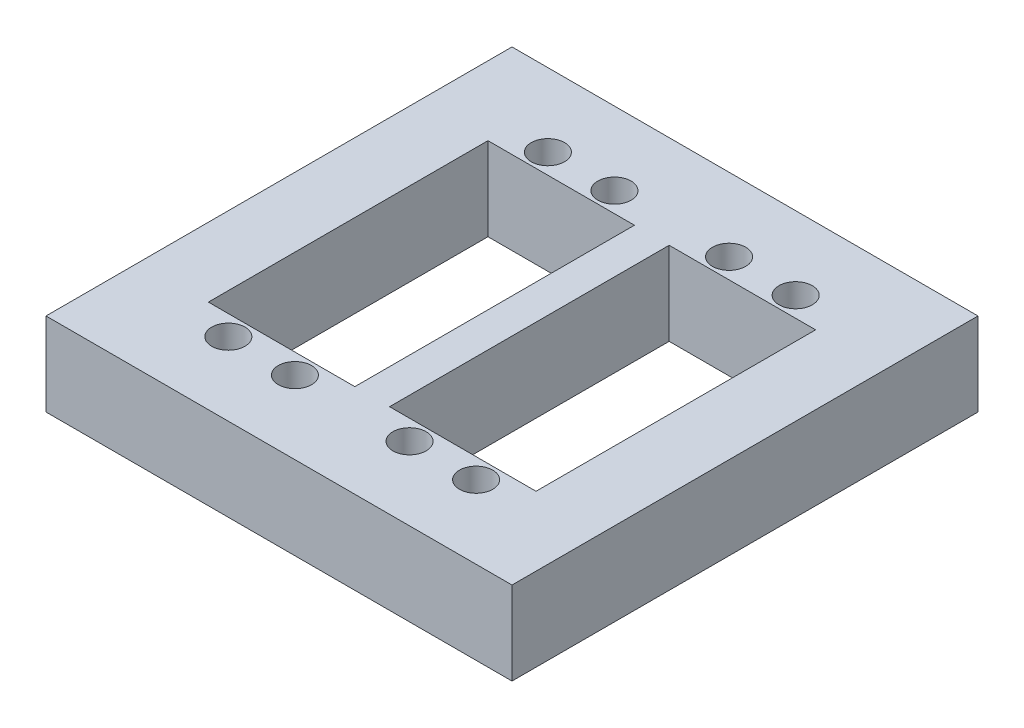
ISO-10303-21;
HEADER;
FILE_DESCRIPTION(('STEP AP214'),'2;1');
FILE_NAME('part.step','',(''),(''),'','','');
FILE_SCHEMA(('AUTOMOTIVE_DESIGN { 1 0 10303 214 1 1 1 1 }'));
ENDSEC;
DATA;
#1=APPLICATION_CONTEXT('core data for automotive mechanical design processes');
#2=APPLICATION_PROTOCOL_DEFINITION('international standard','automotive_design',2000,#1);
#3=PRODUCT_CONTEXT('',#1,'mechanical');
#4=PRODUCT('Part','Part','',(#3));
#5=PRODUCT_RELATED_PRODUCT_CATEGORY('part','',(#4));
#6=PRODUCT_DEFINITION_FORMATION('','',#4);
#7=PRODUCT_DEFINITION_CONTEXT('part definition',#1,'design');
#8=PRODUCT_DEFINITION('design','',#6,#7);
#9=PRODUCT_DEFINITION_SHAPE('','',#8);
#10=(LENGTH_UNIT() NAMED_UNIT(*) SI_UNIT(.MILLI.,.METRE.));
#11=(NAMED_UNIT(*) PLANE_ANGLE_UNIT() SI_UNIT($,.RADIAN.));
#12=(NAMED_UNIT(*) SI_UNIT($,.STERADIAN.) SOLID_ANGLE_UNIT());
#13=UNCERTAINTY_MEASURE_WITH_UNIT(LENGTH_MEASURE(1.E-05),#10,'distance_accuracy_value','');
#14=(GEOMETRIC_REPRESENTATION_CONTEXT(3) GLOBAL_UNCERTAINTY_ASSIGNED_CONTEXT((#13)) GLOBAL_UNIT_ASSIGNED_CONTEXT((#10,
#11,#12)) REPRESENTATION_CONTEXT('',''));
#15=CARTESIAN_POINT('',(0.,0.,0.));
#16=DIRECTION('',(0.,0.,1.));
#17=DIRECTION('',(1.,0.,0.));
#18=AXIS2_PLACEMENT_3D('',#15,#16,#17);
#19=CARTESIAN_POINT('',(0.,12.5,0.));
#20=DIRECTION('',(0.,1.,0.));
#21=DIRECTION('',(0.,0.,1.));
#22=AXIS2_PLACEMENT_3D('',#19,#20,#21);
#23=PLANE('',#22);
#24=CARTESIAN_POINT('',(8.60850096518641,12.5,-24.));
#25=DIRECTION('',(0.,1.,0.));
#26=DIRECTION('',(0.,0.,-1.));
#27=AXIS2_PLACEMENT_3D('',#24,#25,#26);
#28=CIRCLE('',#27,2.5);
#29=CARTESIAN_POINT('',(8.60850096518641,12.5,-26.5));
#30=VERTEX_POINT('',#29);
#31=EDGE_CURVE('E191',#30,#30,#28,.T.);
#32=ORIENTED_EDGE('',*,*,#31,.F.);
#33=EDGE_LOOP('',(#32));
#34=FACE_BOUND('',#33,.T.);
#35=CARTESIAN_POINT('',(8.60850096518641,12.5,24.));
#36=DIRECTION('',(0.,1.,0.));
#37=DIRECTION('',(0.,0.,1.));
#38=AXIS2_PLACEMENT_3D('',#35,#36,#37);
#39=CIRCLE('',#38,2.5);
#40=CARTESIAN_POINT('',(8.60850096518641,12.5,26.5));
#41=VERTEX_POINT('',#40);
#42=EDGE_CURVE('E207',#41,#41,#39,.T.);
#43=ORIENTED_EDGE('',*,*,#42,.F.);
#44=EDGE_LOOP('',(#43));
#45=FACE_BOUND('',#44,.T.);
#46=CARTESIAN_POINT('',(-8.60850096518641,12.5,24.));
#47=DIRECTION('',(0.,1.,0.));
#48=DIRECTION('',(0.,0.,-1.));
#49=AXIS2_PLACEMENT_3D('',#46,#47,#48);
#50=CIRCLE('',#49,2.5);
#51=CARTESIAN_POINT('',(-8.60850096518641,12.5,21.5));
#52=VERTEX_POINT('',#51);
#53=EDGE_CURVE('E223',#52,#52,#50,.T.);
#54=ORIENTED_EDGE('',*,*,#53,.F.);
#55=EDGE_LOOP('',(#54));
#56=FACE_BOUND('',#55,.T.);
#57=CARTESIAN_POINT('',(-18.6085009651864,12.5,-24.));
#58=DIRECTION('',(0.,1.,0.));
#59=DIRECTION('',(0.,0.,1.));
#60=AXIS2_PLACEMENT_3D('',#57,#58,#59);
#61=CIRCLE('',#60,2.5);
#62=CARTESIAN_POINT('',(-18.6085009651864,12.5,-21.5));
#63=VERTEX_POINT('',#62);
#64=EDGE_CURVE('E239',#63,#63,#61,.T.);
#65=ORIENTED_EDGE('',*,*,#64,.F.);
#66=EDGE_LOOP('',(#65));
#67=FACE_BOUND('',#66,.T.);
#68=DIRECTION('',(0.,0.,-1.));
#69=VECTOR('',#68,1.);
#70=CARTESIAN_POINT('',(35.,12.5,-35.));
#71=LINE('',#70,#69);
#72=CARTESIAN_POINT('',(35.,12.5,35.));
#73=VERTEX_POINT('',#72);
#74=CARTESIAN_POINT('',(35.,12.5,-35.));
#75=VERTEX_POINT('',#74);
#76=EDGE_CURVE('E290',#73,#75,#71,.T.);
#77=ORIENTED_EDGE('',*,*,#76,.T.);
#78=DIRECTION('',(-1.,0.,0.));
#79=VECTOR('',#78,1.);
#80=CARTESIAN_POINT('',(-35.,12.5,-35.));
#81=LINE('',#80,#79);
#82=CARTESIAN_POINT('',(-35.,12.5,-35.));
#83=VERTEX_POINT('',#82);
#84=EDGE_CURVE('E294',#75,#83,#81,.T.);
#85=ORIENTED_EDGE('',*,*,#84,.T.);
#86=DIRECTION('',(0.,0.,1.));
#87=VECTOR('',#86,1.);
#88=CARTESIAN_POINT('',(-35.,12.5,-35.));
#89=LINE('',#88,#87);
#90=CARTESIAN_POINT('',(-35.,12.5,35.));
#91=VERTEX_POINT('',#90);
#92=EDGE_CURVE('E298',#83,#91,#89,.T.);
#93=ORIENTED_EDGE('',*,*,#92,.T.);
#94=DIRECTION('',(1.,0.,0.));
#95=VECTOR('',#94,1.);
#96=CARTESIAN_POINT('',(-35.,12.5,35.));
#97=LINE('',#96,#95);
#98=EDGE_CURVE('E301',#91,#73,#97,.T.);
#99=ORIENTED_EDGE('',*,*,#98,.T.);
#100=EDGE_LOOP('',(#77,#85,#93,#99));
#101=FACE_BOUND('',#100,.T.);
#102=DIRECTION('',(-1.,0.,0.));
#103=VECTOR('',#102,1.);
#104=CARTESIAN_POINT('',(-24.6085009651864,12.5,-21.));
#105=LINE('',#104,#103);
#106=CARTESIAN_POINT('',(-2.60850096518641,12.5,-21.));
#107=VERTEX_POINT('',#106);
#108=CARTESIAN_POINT('',(-24.6085009651864,12.5,-21.));
#109=VERTEX_POINT('',#108);
#110=EDGE_CURVE('E250',#107,#109,#105,.T.);
#111=ORIENTED_EDGE('',*,*,#110,.F.);
#112=DIRECTION('',(0.,0.,-1.));
#113=VECTOR('',#112,1.);
#114=CARTESIAN_POINT('',(-2.60850096518641,12.5,-21.));
#115=LINE('',#114,#113);
#116=CARTESIAN_POINT('',(-2.6085009651864,12.5,21.));
#117=VERTEX_POINT('',#116);
#118=EDGE_CURVE('E247',#117,#107,#115,.T.);
#119=ORIENTED_EDGE('',*,*,#118,.F.);
#120=DIRECTION('',(1.,0.,0.));
#121=VECTOR('',#120,1.);
#122=CARTESIAN_POINT('',(-24.6085009651864,12.5,21.));
#123=LINE('',#122,#121);
#124=CARTESIAN_POINT('',(-24.6085009651864,12.5,21.));
#125=VERTEX_POINT('',#124);
#126=EDGE_CURVE('E258',#125,#117,#123,.T.);
#127=ORIENTED_EDGE('',*,*,#126,.F.);
#128=DIRECTION('',(0.,0.,1.));
#129=VECTOR('',#128,1.);
#130=CARTESIAN_POINT('',(-24.6085009651864,12.5,-21.));
#131=LINE('',#130,#129);
#132=EDGE_CURVE('E254',#109,#125,#131,.T.);
#133=ORIENTED_EDGE('',*,*,#132,.F.);
#134=EDGE_LOOP('',(#111,#119,#127,#133));
#135=FACE_BOUND('',#134,.T.);
#136=CARTESIAN_POINT('',(-8.60850096518641,12.5,-24.));
#137=DIRECTION('',(0.,1.,0.));
#138=DIRECTION('',(0.,0.,1.));
#139=AXIS2_PLACEMENT_3D('',#136,#137,#138);
#140=CIRCLE('',#139,2.5);
#141=CARTESIAN_POINT('',(-8.60850096518641,12.5,-21.5));
#142=VERTEX_POINT('',#141);
#143=EDGE_CURVE('E231',#142,#142,#140,.T.);
#144=ORIENTED_EDGE('',*,*,#143,.F.);
#145=EDGE_LOOP('',(#144));
#146=FACE_BOUND('',#145,.T.);
#147=CARTESIAN_POINT('',(-18.6085009651864,12.5,24.));
#148=DIRECTION('',(0.,1.,0.));
#149=DIRECTION('',(0.,0.,-1.));
#150=AXIS2_PLACEMENT_3D('',#147,#148,#149);
#151=CIRCLE('',#150,2.5);
#152=CARTESIAN_POINT('',(-18.6085009651864,12.5,21.5));
#153=VERTEX_POINT('',#152);
#154=EDGE_CURVE('E215',#153,#153,#151,.T.);
#155=ORIENTED_EDGE('',*,*,#154,.F.);
#156=EDGE_LOOP('',(#155));
#157=FACE_BOUND('',#156,.T.);
#158=CARTESIAN_POINT('',(18.6085009651864,12.5,24.));
#159=DIRECTION('',(0.,1.,0.));
#160=DIRECTION('',(0.,0.,1.));
#161=AXIS2_PLACEMENT_3D('',#158,#159,#160);
#162=CIRCLE('',#161,2.5);
#163=CARTESIAN_POINT('',(18.6085009651864,12.5,26.5));
#164=VERTEX_POINT('',#163);
#165=EDGE_CURVE('E199',#164,#164,#162,.T.);
#166=ORIENTED_EDGE('',*,*,#165,.F.);
#167=EDGE_LOOP('',(#166));
#168=FACE_BOUND('',#167,.T.);
#169=CARTESIAN_POINT('',(18.6085009651864,12.5,-24.));
#170=DIRECTION('',(0.,1.,0.));
#171=DIRECTION('',(0.,0.,-1.));
#172=AXIS2_PLACEMENT_3D('',#169,#170,#171);
#173=CIRCLE('',#172,2.5);
#174=CARTESIAN_POINT('',(18.6085009651864,12.5,-26.5));
#175=VERTEX_POINT('',#174);
#176=EDGE_CURVE('E183',#175,#175,#173,.T.);
#177=ORIENTED_EDGE('',*,*,#176,.F.);
#178=EDGE_LOOP('',(#177));
#179=FACE_BOUND('',#178,.T.);
#180=DIRECTION('',(-1.,0.,0.));
#181=VECTOR('',#180,1.);
#182=CARTESIAN_POINT('',(24.6085009651864,12.5,-21.));
#183=LINE('',#182,#181);
#184=CARTESIAN_POINT('',(24.6085009651864,12.5,-21.));
#185=VERTEX_POINT('',#184);
#186=CARTESIAN_POINT('',(2.60850096518642,12.5,-21.));
#187=VERTEX_POINT('',#186);
#188=EDGE_CURVE('E144',#185,#187,#183,.T.);
#189=ORIENTED_EDGE('',*,*,#188,.F.);
#190=DIRECTION('',(0.,0.,-1.));
#191=VECTOR('',#190,1.);
#192=CARTESIAN_POINT('',(24.6085009651864,12.5,-21.));
#193=LINE('',#192,#191);
#194=CARTESIAN_POINT('',(24.6085009651864,12.5,21.));
#195=VERTEX_POINT('',#194);
#196=EDGE_CURVE('E135',#195,#185,#193,.T.);
#197=ORIENTED_EDGE('',*,*,#196,.F.);
#198=DIRECTION('',(1.,0.,0.));
#199=VECTOR('',#198,1.);
#200=CARTESIAN_POINT('',(24.6085009651864,12.5,21.));
#201=LINE('',#200,#199);
#202=CARTESIAN_POINT('',(2.60850096518642,12.5,21.));
#203=VERTEX_POINT('',#202);
#204=EDGE_CURVE('E161',#203,#195,#201,.T.);
#205=ORIENTED_EDGE('',*,*,#204,.F.);
#206=DIRECTION('',(0.,0.,1.));
#207=VECTOR('',#206,1.);
#208=CARTESIAN_POINT('',(2.60850096518642,12.5,-21.));
#209=LINE('',#208,#207);
#210=EDGE_CURVE('E157',#187,#203,#209,.T.);
#211=ORIENTED_EDGE('',*,*,#210,.F.);
#212=EDGE_LOOP('',(#189,#197,#205,#211));
#213=FACE_BOUND('',#212,.T.);
#214=ADVANCED_FACE('F45',(#34,#45,#56,#67,#101,#135,#146,#157,#168,#179,#213),#23,.T.);
#215=CARTESIAN_POINT('',(0.,0.,0.));
#216=DIRECTION('',(0.,1.,0.));
#217=DIRECTION('',(0.,0.,1.));
#218=AXIS2_PLACEMENT_3D('',#215,#216,#217);
#219=PLANE('',#218);
#220=CARTESIAN_POINT('',(18.6085009651864,0.,-24.));
#221=DIRECTION('',(0.,1.,0.));
#222=DIRECTION('',(0.,0.,-1.));
#223=AXIS2_PLACEMENT_3D('',#220,#221,#222);
#224=CIRCLE('',#223,2.5);
#225=CARTESIAN_POINT('',(18.6085009651864,0.,-26.5));
#226=VERTEX_POINT('',#225);
#227=EDGE_CURVE('E153',#226,#226,#224,.T.);
#228=ORIENTED_EDGE('',*,*,#227,.T.);
#229=EDGE_LOOP('',(#228));
#230=FACE_BOUND('',#229,.T.);
#231=CARTESIAN_POINT('',(8.60850096518641,0.,-24.));
#232=DIRECTION('',(0.,1.,0.));
#233=DIRECTION('',(0.,0.,-1.));
#234=AXIS2_PLACEMENT_3D('',#231,#232,#233);
#235=CIRCLE('',#234,2.5);
#236=CARTESIAN_POINT('',(8.60850096518641,0.,-26.5));
#237=VERTEX_POINT('',#236);
#238=EDGE_CURVE('E187',#237,#237,#235,.T.);
#239=ORIENTED_EDGE('',*,*,#238,.T.);
#240=EDGE_LOOP('',(#239));
#241=FACE_BOUND('',#240,.T.);
#242=CARTESIAN_POINT('',(18.6085009651864,0.,24.));
#243=DIRECTION('',(0.,1.,0.));
#244=DIRECTION('',(0.,0.,1.));
#245=AXIS2_PLACEMENT_3D('',#242,#243,#244);
#246=CIRCLE('',#245,2.5);
#247=CARTESIAN_POINT('',(18.6085009651864,0.,26.5));
#248=VERTEX_POINT('',#247);
#249=EDGE_CURVE('E195',#248,#248,#246,.T.);
#250=ORIENTED_EDGE('',*,*,#249,.T.);
#251=EDGE_LOOP('',(#250));
#252=FACE_BOUND('',#251,.T.);
#253=CARTESIAN_POINT('',(8.60850096518641,0.,24.));
#254=DIRECTION('',(0.,1.,0.));
#255=DIRECTION('',(0.,0.,1.));
#256=AXIS2_PLACEMENT_3D('',#253,#254,#255);
#257=CIRCLE('',#256,2.5);
#258=CARTESIAN_POINT('',(8.60850096518641,0.,26.5));
#259=VERTEX_POINT('',#258);
#260=EDGE_CURVE('E203',#259,#259,#257,.T.);
#261=ORIENTED_EDGE('',*,*,#260,.T.);
#262=EDGE_LOOP('',(#261));
#263=FACE_BOUND('',#262,.T.);
#264=CARTESIAN_POINT('',(-18.6085009651864,0.,24.));
#265=DIRECTION('',(0.,1.,0.));
#266=DIRECTION('',(0.,0.,-1.));
#267=AXIS2_PLACEMENT_3D('',#264,#265,#266);
#268=CIRCLE('',#267,2.5);
#269=CARTESIAN_POINT('',(-18.6085009651864,0.,21.5));
#270=VERTEX_POINT('',#269);
#271=EDGE_CURVE('E211',#270,#270,#268,.T.);
#272=ORIENTED_EDGE('',*,*,#271,.T.);
#273=EDGE_LOOP('',(#272));
#274=FACE_BOUND('',#273,.T.);
#275=CARTESIAN_POINT('',(-8.60850096518641,0.,24.));
#276=DIRECTION('',(0.,1.,0.));
#277=DIRECTION('',(0.,0.,-1.));
#278=AXIS2_PLACEMENT_3D('',#275,#276,#277);
#279=CIRCLE('',#278,2.5);
#280=CARTESIAN_POINT('',(-8.60850096518641,0.,21.5));
#281=VERTEX_POINT('',#280);
#282=EDGE_CURVE('E219',#281,#281,#279,.T.);
#283=ORIENTED_EDGE('',*,*,#282,.T.);
#284=EDGE_LOOP('',(#283));
#285=FACE_BOUND('',#284,.T.);
#286=CARTESIAN_POINT('',(-8.60850096518641,0.,-24.));
#287=DIRECTION('',(0.,1.,0.));
#288=DIRECTION('',(0.,0.,1.));
#289=AXIS2_PLACEMENT_3D('',#286,#287,#288);
#290=CIRCLE('',#289,2.5);
#291=CARTESIAN_POINT('',(-8.60850096518641,0.,-21.5));
#292=VERTEX_POINT('',#291);
#293=EDGE_CURVE('E227',#292,#292,#290,.T.);
#294=ORIENTED_EDGE('',*,*,#293,.T.);
#295=EDGE_LOOP('',(#294));
#296=FACE_BOUND('',#295,.T.);
#297=CARTESIAN_POINT('',(-18.6085009651864,0.,-24.));
#298=DIRECTION('',(0.,1.,0.));
#299=DIRECTION('',(0.,0.,1.));
#300=AXIS2_PLACEMENT_3D('',#297,#298,#299);
#301=CIRCLE('',#300,2.5);
#302=CARTESIAN_POINT('',(-18.6085009651864,0.,-21.5));
#303=VERTEX_POINT('',#302);
#304=EDGE_CURVE('E235',#303,#303,#301,.T.);
#305=ORIENTED_EDGE('',*,*,#304,.T.);
#306=EDGE_LOOP('',(#305));
#307=FACE_BOUND('',#306,.T.);
#308=DIRECTION('',(0.,0.,-1.));
#309=VECTOR('',#308,1.);
#310=CARTESIAN_POINT('',(-2.60850096518641,0.,-21.));
#311=LINE('',#310,#309);
#312=CARTESIAN_POINT('',(-2.6085009651864,0.,21.));
#313=VERTEX_POINT('',#312);
#314=CARTESIAN_POINT('',(-2.60850096518641,0.,-21.));
#315=VERTEX_POINT('',#314);
#316=EDGE_CURVE('E243',#313,#315,#311,.T.);
#317=ORIENTED_EDGE('',*,*,#316,.T.);
#318=DIRECTION('',(-1.,0.,0.));
#319=VECTOR('',#318,1.);
#320=CARTESIAN_POINT('',(-24.6085009651864,0.,-21.));
#321=LINE('',#320,#319);
#322=CARTESIAN_POINT('',(-24.6085009651864,0.,-21.));
#323=VERTEX_POINT('',#322);
#324=EDGE_CURVE('E265',#315,#323,#321,.T.);
#325=ORIENTED_EDGE('',*,*,#324,.T.);
#326=DIRECTION('',(0.,0.,1.));
#327=VECTOR('',#326,1.);
#328=CARTESIAN_POINT('',(-24.6085009651864,0.,-21.));
#329=LINE('',#328,#327);
#330=CARTESIAN_POINT('',(-24.6085009651864,0.,21.));
#331=VERTEX_POINT('',#330);
#332=EDGE_CURVE('E269',#323,#331,#329,.T.);
#333=ORIENTED_EDGE('',*,*,#332,.T.);
#334=DIRECTION('',(1.,0.,0.));
#335=VECTOR('',#334,1.);
#336=CARTESIAN_POINT('',(-24.6085009651864,0.,21.));
#337=LINE('',#336,#335);
#338=EDGE_CURVE('E251',#331,#313,#337,.T.);
#339=ORIENTED_EDGE('',*,*,#338,.T.);
#340=EDGE_LOOP('',(#317,#325,#333,#339));
#341=FACE_BOUND('',#340,.T.);
#342=DIRECTION('',(0.,0.,-1.));
#343=VECTOR('',#342,1.);
#344=CARTESIAN_POINT('',(35.,0.,-35.));
#345=LINE('',#344,#343);
#346=CARTESIAN_POINT('',(35.,0.,35.));
#347=VERTEX_POINT('',#346);
#348=CARTESIAN_POINT('',(35.,0.,-35.));
#349=VERTEX_POINT('',#348);
#350=EDGE_CURVE('E289',#347,#349,#345,.T.);
#351=ORIENTED_EDGE('',*,*,#350,.F.);
#352=DIRECTION('',(1.,0.,0.));
#353=VECTOR('',#352,1.);
#354=CARTESIAN_POINT('',(-35.,0.,35.));
#355=LINE('',#354,#353);
#356=CARTESIAN_POINT('',(-35.,0.,35.));
#357=VERTEX_POINT('',#356);
#358=EDGE_CURVE('E295',#357,#347,#355,.T.);
#359=ORIENTED_EDGE('',*,*,#358,.F.);
#360=DIRECTION('',(0.,0.,1.));
#361=VECTOR('',#360,1.);
#362=CARTESIAN_POINT('',(-35.,0.,-35.));
#363=LINE('',#362,#361);
#364=CARTESIAN_POINT('',(-35.,0.,-35.));
#365=VERTEX_POINT('',#364);
#366=EDGE_CURVE('E311',#365,#357,#363,.T.);
#367=ORIENTED_EDGE('',*,*,#366,.F.);
#368=DIRECTION('',(-1.,0.,0.));
#369=VECTOR('',#368,1.);
#370=CARTESIAN_POINT('',(-35.,0.,-35.));
#371=LINE('',#370,#369);
#372=EDGE_CURVE('E308',#349,#365,#371,.T.);
#373=ORIENTED_EDGE('',*,*,#372,.F.);
#374=EDGE_LOOP('',(#351,#359,#367,#373));
#375=FACE_BOUND('',#374,.T.);
#376=DIRECTION('',(0.,0.,-1.));
#377=VECTOR('',#376,1.);
#378=CARTESIAN_POINT('',(24.6085009651864,0.,-21.));
#379=LINE('',#378,#377);
#380=CARTESIAN_POINT('',(24.6085009651864,0.,21.));
#381=VERTEX_POINT('',#380);
#382=CARTESIAN_POINT('',(24.6085009651864,0.,-21.));
#383=VERTEX_POINT('',#382);
#384=EDGE_CURVE('E69',#381,#383,#379,.T.);
#385=ORIENTED_EDGE('',*,*,#384,.T.);
#386=DIRECTION('',(-1.,0.,0.));
#387=VECTOR('',#386,1.);
#388=CARTESIAN_POINT('',(24.6085009651864,0.,-21.));
#389=LINE('',#388,#387);
#390=CARTESIAN_POINT('',(2.60850096518642,0.,-21.));
#391=VERTEX_POINT('',#390);
#392=EDGE_CURVE('E151',#383,#391,#389,.T.);
#393=ORIENTED_EDGE('',*,*,#392,.T.);
#394=DIRECTION('',(0.,0.,1.));
#395=VECTOR('',#394,1.);
#396=CARTESIAN_POINT('',(2.60850096518642,0.,-21.));
#397=LINE('',#396,#395);
#398=CARTESIAN_POINT('',(2.60850096518642,0.,21.));
#399=VERTEX_POINT('',#398);
#400=EDGE_CURVE('E170',#391,#399,#397,.T.);
#401=ORIENTED_EDGE('',*,*,#400,.T.);
#402=DIRECTION('',(1.,0.,0.));
#403=VECTOR('',#402,1.);
#404=CARTESIAN_POINT('',(24.6085009651864,0.,21.));
#405=LINE('',#404,#403);
#406=EDGE_CURVE('E145',#399,#381,#405,.T.);
#407=ORIENTED_EDGE('',*,*,#406,.T.);
#408=EDGE_LOOP('',(#385,#393,#401,#407));
#409=FACE_BOUND('',#408,.T.);
#410=ADVANCED_FACE('F334',(#230,#241,#252,#263,#274,#285,#296,#307,#341,#375,#409),#219,.F.);
#411=CARTESIAN_POINT('',(35.,12.5,-35.));
#412=DIRECTION('',(-1.,0.,0.));
#413=DIRECTION('',(0.,0.,1.));
#414=AXIS2_PLACEMENT_3D('',#411,#412,#413);
#415=PLANE('',#414);
#416=ORIENTED_EDGE('',*,*,#350,.T.);
#417=DIRECTION('',(0.,-1.,0.));
#418=VECTOR('',#417,1.);
#419=CARTESIAN_POINT('',(35.,12.5,-35.));
#420=LINE('',#419,#418);
#421=EDGE_CURVE('E11',#75,#349,#420,.T.);
#422=ORIENTED_EDGE('',*,*,#421,.F.);
#423=ORIENTED_EDGE('',*,*,#76,.F.);
#424=DIRECTION('',(0.,-1.,0.));
#425=VECTOR('',#424,1.);
#426=CARTESIAN_POINT('',(35.,12.5,35.));
#427=LINE('',#426,#425);
#428=EDGE_CURVE('E304',#73,#347,#427,.T.);
#429=ORIENTED_EDGE('',*,*,#428,.T.);
#430=EDGE_LOOP('',(#416,#422,#423,#429));
#431=FACE_BOUND('',#430,.T.);
#432=ADVANCED_FACE('F47',(#431),#415,.F.);
#433=CARTESIAN_POINT('',(-35.,12.5,-35.));
#434=DIRECTION('',(0.,0.,1.));
#435=DIRECTION('',(1.,0.,0.));
#436=AXIS2_PLACEMENT_3D('',#433,#434,#435);
#437=PLANE('',#436);
#438=ORIENTED_EDGE('',*,*,#372,.T.);
#439=DIRECTION('',(0.,-1.,0.));
#440=VECTOR('',#439,1.);
#441=CARTESIAN_POINT('',(-35.,12.5,-35.));
#442=LINE('',#441,#440);
#443=EDGE_CURVE('E54',#83,#365,#442,.T.);
#444=ORIENTED_EDGE('',*,*,#443,.F.);
#445=ORIENTED_EDGE('',*,*,#84,.F.);
#446=ORIENTED_EDGE('',*,*,#421,.T.);
#447=EDGE_LOOP('',(#438,#444,#445,#446));
#448=FACE_BOUND('',#447,.T.);
#449=ADVANCED_FACE('F345',(#448),#437,.F.);
#450=CARTESIAN_POINT('',(-35.,12.5,-35.));
#451=DIRECTION('',(1.,0.,0.));
#452=DIRECTION('',(0.,0.,-1.));
#453=AXIS2_PLACEMENT_3D('',#450,#451,#452);
#454=PLANE('',#453);
#455=ORIENTED_EDGE('',*,*,#366,.T.);
#456=DIRECTION('',(0.,-1.,0.));
#457=VECTOR('',#456,1.);
#458=CARTESIAN_POINT('',(-35.,12.5,35.));
#459=LINE('',#458,#457);
#460=EDGE_CURVE('E319',#91,#357,#459,.T.);
#461=ORIENTED_EDGE('',*,*,#460,.F.);
#462=ORIENTED_EDGE('',*,*,#92,.F.);
#463=ORIENTED_EDGE('',*,*,#443,.T.);
#464=EDGE_LOOP('',(#455,#461,#462,#463));
#465=FACE_BOUND('',#464,.T.);
#466=ADVANCED_FACE('F328',(#465),#454,.F.);
#467=CARTESIAN_POINT('',(-35.,12.5,35.));
#468=DIRECTION('',(0.,0.,-1.));
#469=DIRECTION('',(-1.,0.,0.));
#470=AXIS2_PLACEMENT_3D('',#467,#468,#469);
#471=PLANE('',#470);
#472=ORIENTED_EDGE('',*,*,#358,.T.);
#473=ORIENTED_EDGE('',*,*,#428,.F.);
#474=ORIENTED_EDGE('',*,*,#98,.F.);
#475=ORIENTED_EDGE('',*,*,#460,.T.);
#476=EDGE_LOOP('',(#472,#473,#474,#475));
#477=FACE_BOUND('',#476,.T.);
#478=ADVANCED_FACE('F338',(#477),#471,.F.);
#479=CARTESIAN_POINT('',(-2.60850096518641,12.5,-21.));
#480=DIRECTION('',(-1.,0.,0.));
#481=DIRECTION('',(0.,0.,1.));
#482=AXIS2_PLACEMENT_3D('',#479,#480,#481);
#483=PLANE('',#482);
#484=ORIENTED_EDGE('',*,*,#316,.F.);
#485=DIRECTION('',(0.,-1.,0.));
#486=VECTOR('',#485,1.);
#487=CARTESIAN_POINT('',(-2.6085009651864,12.5,21.));
#488=LINE('',#487,#486);
#489=EDGE_CURVE('E261',#117,#313,#488,.T.);
#490=ORIENTED_EDGE('',*,*,#489,.F.);
#491=ORIENTED_EDGE('',*,*,#118,.T.);
#492=DIRECTION('',(0.,-1.,0.));
#493=VECTOR('',#492,1.);
#494=CARTESIAN_POINT('',(-2.60850096518641,12.5,-21.));
#495=LINE('',#494,#493);
#496=EDGE_CURVE('E285',#107,#315,#495,.T.);
#497=ORIENTED_EDGE('',*,*,#496,.T.);
#498=EDGE_LOOP('',(#484,#490,#491,#497));
#499=FACE_BOUND('',#498,.T.);
#500=ADVANCED_FACE('F363',(#499),#483,.T.);
#501=CARTESIAN_POINT('',(-24.6085009651864,12.5,-21.));
#502=DIRECTION('',(0.,0.,1.));
#503=DIRECTION('',(1.,0.,0.));
#504=AXIS2_PLACEMENT_3D('',#501,#502,#503);
#505=PLANE('',#504);
#506=ORIENTED_EDGE('',*,*,#324,.F.);
#507=ORIENTED_EDGE('',*,*,#496,.F.);
#508=ORIENTED_EDGE('',*,*,#110,.T.);
#509=DIRECTION('',(0.,-1.,0.));
#510=VECTOR('',#509,1.);
#511=CARTESIAN_POINT('',(-24.6085009651864,12.5,-21.));
#512=LINE('',#511,#510);
#513=EDGE_CURVE('E282',#109,#323,#512,.T.);
#514=ORIENTED_EDGE('',*,*,#513,.T.);
#515=EDGE_LOOP('',(#506,#507,#508,#514));
#516=FACE_BOUND('',#515,.T.);
#517=ADVANCED_FACE('F370',(#516),#505,.T.);
#518=CARTESIAN_POINT('',(-24.6085009651864,12.5,-21.));
#519=DIRECTION('',(1.,0.,0.));
#520=DIRECTION('',(0.,0.,-1.));
#521=AXIS2_PLACEMENT_3D('',#518,#519,#520);
#522=PLANE('',#521);
#523=ORIENTED_EDGE('',*,*,#332,.F.);
#524=ORIENTED_EDGE('',*,*,#513,.F.);
#525=ORIENTED_EDGE('',*,*,#132,.T.);
#526=DIRECTION('',(0.,-1.,0.));
#527=VECTOR('',#526,1.);
#528=CARTESIAN_POINT('',(-24.6085009651864,12.5,21.));
#529=LINE('',#528,#527);
#530=EDGE_CURVE('E279',#125,#331,#529,.T.);
#531=ORIENTED_EDGE('',*,*,#530,.T.);
#532=EDGE_LOOP('',(#523,#524,#525,#531));
#533=FACE_BOUND('',#532,.T.);
#534=ADVANCED_FACE('F375',(#533),#522,.T.);
#535=CARTESIAN_POINT('',(-24.6085009651864,12.5,21.));
#536=DIRECTION('',(0.,0.,-1.));
#537=DIRECTION('',(-1.,0.,0.));
#538=AXIS2_PLACEMENT_3D('',#535,#536,#537);
#539=PLANE('',#538);
#540=ORIENTED_EDGE('',*,*,#338,.F.);
#541=ORIENTED_EDGE('',*,*,#530,.F.);
#542=ORIENTED_EDGE('',*,*,#126,.T.);
#543=ORIENTED_EDGE('',*,*,#489,.T.);
#544=EDGE_LOOP('',(#540,#541,#542,#543));
#545=FACE_BOUND('',#544,.T.);
#546=ADVANCED_FACE('F383',(#545),#539,.T.);
#547=CARTESIAN_POINT('',(-18.6085009651864,12.5,-24.));
#548=DIRECTION('',(0.,-1.,0.));
#549=DIRECTION('',(0.,0.,-1.));
#550=AXIS2_PLACEMENT_3D('',#547,#548,#549);
#551=CYLINDRICAL_SURFACE('',#550,2.5);
#552=ORIENTED_EDGE('',*,*,#64,.T.);
#553=EDGE_LOOP('',(#552));
#554=FACE_BOUND('',#553,.T.);
#555=ORIENTED_EDGE('',*,*,#304,.F.);
#556=EDGE_LOOP('',(#555));
#557=FACE_BOUND('',#556,.T.);
#558=ADVANCED_FACE('F420',(#554,#557),#551,.F.);
#559=CARTESIAN_POINT('',(-8.60850096518641,12.5,-24.));
#560=DIRECTION('',(0.,-1.,0.));
#561=DIRECTION('',(0.,0.,-1.));
#562=AXIS2_PLACEMENT_3D('',#559,#560,#561);
#563=CYLINDRICAL_SURFACE('',#562,2.5);
#564=ORIENTED_EDGE('',*,*,#143,.T.);
#565=EDGE_LOOP('',(#564));
#566=FACE_BOUND('',#565,.T.);
#567=ORIENTED_EDGE('',*,*,#293,.F.);
#568=EDGE_LOOP('',(#567));
#569=FACE_BOUND('',#568,.T.);
#570=ADVANCED_FACE('F422',(#566,#569),#563,.F.);
#571=CARTESIAN_POINT('',(-8.60850096518641,12.5,24.));
#572=DIRECTION('',(0.,-1.,0.));
#573=DIRECTION('',(0.,0.,-1.));
#574=AXIS2_PLACEMENT_3D('',#571,#572,#573);
#575=CYLINDRICAL_SURFACE('',#574,2.5);
#576=ORIENTED_EDGE('',*,*,#53,.T.);
#577=EDGE_LOOP('',(#576));
#578=FACE_BOUND('',#577,.T.);
#579=ORIENTED_EDGE('',*,*,#282,.F.);
#580=EDGE_LOOP('',(#579));
#581=FACE_BOUND('',#580,.T.);
#582=ADVANCED_FACE('F429',(#578,#581),#575,.F.);
#583=CARTESIAN_POINT('',(-18.6085009651864,12.5,24.));
#584=DIRECTION('',(0.,-1.,0.));
#585=DIRECTION('',(0.,0.,-1.));
#586=AXIS2_PLACEMENT_3D('',#583,#584,#585);
#587=CYLINDRICAL_SURFACE('',#586,2.5);
#588=ORIENTED_EDGE('',*,*,#154,.T.);
#589=EDGE_LOOP('',(#588));
#590=FACE_BOUND('',#589,.T.);
#591=ORIENTED_EDGE('',*,*,#271,.F.);
#592=EDGE_LOOP('',(#591));
#593=FACE_BOUND('',#592,.T.);
#594=ADVANCED_FACE('F465',(#590,#593),#587,.F.);
#595=CARTESIAN_POINT('',(8.60850096518641,12.5,24.));
#596=DIRECTION('',(0.,-1.,0.));
#597=DIRECTION('',(0.,0.,-1.));
#598=AXIS2_PLACEMENT_3D('',#595,#596,#597);
#599=CYLINDRICAL_SURFACE('',#598,2.5);
#600=ORIENTED_EDGE('',*,*,#42,.T.);
#601=EDGE_LOOP('',(#600));
#602=FACE_BOUND('',#601,.T.);
#603=ORIENTED_EDGE('',*,*,#260,.F.);
#604=EDGE_LOOP('',(#603));
#605=FACE_BOUND('',#604,.T.);
#606=ADVANCED_FACE('F474',(#602,#605),#599,.F.);
#607=CARTESIAN_POINT('',(18.6085009651864,12.5,24.));
#608=DIRECTION('',(0.,-1.,0.));
#609=DIRECTION('',(0.,0.,-1.));
#610=AXIS2_PLACEMENT_3D('',#607,#608,#609);
#611=CYLINDRICAL_SURFACE('',#610,2.5);
#612=ORIENTED_EDGE('',*,*,#165,.T.);
#613=EDGE_LOOP('',(#612));
#614=FACE_BOUND('',#613,.T.);
#615=ORIENTED_EDGE('',*,*,#249,.F.);
#616=EDGE_LOOP('',(#615));
#617=FACE_BOUND('',#616,.T.);
#618=ADVANCED_FACE('F484',(#614,#617),#611,.F.);
#619=CARTESIAN_POINT('',(8.60850096518641,12.5,-24.));
#620=DIRECTION('',(0.,-1.,0.));
#621=DIRECTION('',(0.,0.,-1.));
#622=AXIS2_PLACEMENT_3D('',#619,#620,#621);
#623=CYLINDRICAL_SURFACE('',#622,2.5);
#624=ORIENTED_EDGE('',*,*,#31,.T.);
#625=EDGE_LOOP('',(#624));
#626=FACE_BOUND('',#625,.T.);
#627=ORIENTED_EDGE('',*,*,#238,.F.);
#628=EDGE_LOOP('',(#627));
#629=FACE_BOUND('',#628,.T.);
#630=ADVANCED_FACE('F402',(#626,#629),#623,.F.);
#631=CARTESIAN_POINT('',(18.6085009651864,12.5,-24.));
#632=DIRECTION('',(0.,-1.,0.));
#633=DIRECTION('',(0.,0.,-1.));
#634=AXIS2_PLACEMENT_3D('',#631,#632,#633);
#635=CYLINDRICAL_SURFACE('',#634,2.5);
#636=ORIENTED_EDGE('',*,*,#176,.T.);
#637=EDGE_LOOP('',(#636));
#638=FACE_BOUND('',#637,.T.);
#639=ORIENTED_EDGE('',*,*,#227,.F.);
#640=EDGE_LOOP('',(#639));
#641=FACE_BOUND('',#640,.T.);
#642=ADVANCED_FACE('F399',(#638,#641),#635,.F.);
#643=CARTESIAN_POINT('',(24.6085009651864,12.5,-21.));
#644=DIRECTION('',(-1.,0.,0.));
#645=DIRECTION('',(0.,0.,1.));
#646=AXIS2_PLACEMENT_3D('',#643,#644,#645);
#647=PLANE('',#646);
#648=ORIENTED_EDGE('',*,*,#384,.F.);
#649=DIRECTION('',(0.,-1.,0.));
#650=VECTOR('',#649,1.);
#651=CARTESIAN_POINT('',(24.6085009651864,12.5,21.));
#652=LINE('',#651,#650);
#653=EDGE_CURVE('E139',#195,#381,#652,.T.);
#654=ORIENTED_EDGE('',*,*,#653,.F.);
#655=ORIENTED_EDGE('',*,*,#196,.T.);
#656=DIRECTION('',(0.,-1.,0.));
#657=VECTOR('',#656,1.);
#658=CARTESIAN_POINT('',(24.6085009651864,12.5,-21.));
#659=LINE('',#658,#657);
#660=EDGE_CURVE('E138',#185,#383,#659,.T.);
#661=ORIENTED_EDGE('',*,*,#660,.T.);
#662=EDGE_LOOP('',(#648,#654,#655,#661));
#663=FACE_BOUND('',#662,.T.);
#664=ADVANCED_FACE('F137',(#663),#647,.T.);
#665=CARTESIAN_POINT('',(24.6085009651864,12.5,-21.));
#666=DIRECTION('',(0.,0.,1.));
#667=DIRECTION('',(1.,0.,0.));
#668=AXIS2_PLACEMENT_3D('',#665,#666,#667);
#669=PLANE('',#668);
#670=ORIENTED_EDGE('',*,*,#392,.F.);
#671=ORIENTED_EDGE('',*,*,#660,.F.);
#672=ORIENTED_EDGE('',*,*,#188,.T.);
#673=DIRECTION('',(0.,-1.,0.));
#674=VECTOR('',#673,1.);
#675=CARTESIAN_POINT('',(2.60850096518642,12.5,-21.));
#676=LINE('',#675,#674);
#677=EDGE_CURVE('E154',#187,#391,#676,.T.);
#678=ORIENTED_EDGE('',*,*,#677,.T.);
#679=EDGE_LOOP('',(#670,#671,#672,#678));
#680=FACE_BOUND('',#679,.T.);
#681=ADVANCED_FACE('F148',(#680),#669,.T.);
#682=CARTESIAN_POINT('',(2.60850096518642,12.5,-21.));
#683=DIRECTION('',(1.,0.,0.));
#684=DIRECTION('',(0.,0.,-1.));
#685=AXIS2_PLACEMENT_3D('',#682,#683,#684);
#686=PLANE('',#685);
#687=ORIENTED_EDGE('',*,*,#400,.F.);
#688=ORIENTED_EDGE('',*,*,#677,.F.);
#689=ORIENTED_EDGE('',*,*,#210,.T.);
#690=DIRECTION('',(0.,-1.,0.));
#691=VECTOR('',#690,1.);
#692=CARTESIAN_POINT('',(2.60850096518642,12.5,21.));
#693=LINE('',#692,#691);
#694=EDGE_CURVE('E61',#203,#399,#693,.T.);
#695=ORIENTED_EDGE('',*,*,#694,.T.);
#696=EDGE_LOOP('',(#687,#688,#689,#695));
#697=FACE_BOUND('',#696,.T.);
#698=ADVANCED_FACE('F526',(#697),#686,.T.);
#699=CARTESIAN_POINT('',(24.6085009651864,12.5,21.));
#700=DIRECTION('',(0.,0.,-1.));
#701=DIRECTION('',(-1.,0.,0.));
#702=AXIS2_PLACEMENT_3D('',#699,#700,#701);
#703=PLANE('',#702);
#704=ORIENTED_EDGE('',*,*,#406,.F.);
#705=ORIENTED_EDGE('',*,*,#694,.F.);
#706=ORIENTED_EDGE('',*,*,#204,.T.);
#707=ORIENTED_EDGE('',*,*,#653,.T.);
#708=EDGE_LOOP('',(#704,#705,#706,#707));
#709=FACE_BOUND('',#708,.T.);
#710=ADVANCED_FACE('F535',(#709),#703,.T.);
#711=CLOSED_SHELL('',(#214,#410,#432,#449,#466,#478,#500,#517,#534,#546,#558,#570,#582,#594,
#606,#618,#630,#642,#664,#681,#698,#710));
#712=MANIFOLD_SOLID_BREP('B2',#711);
#713=ADVANCED_BREP_SHAPE_REPRESENTATION('',(#18,#712),#14);
#714=SHAPE_DEFINITION_REPRESENTATION(#9,#713);
ENDSEC;
END-ISO-10303-21;
